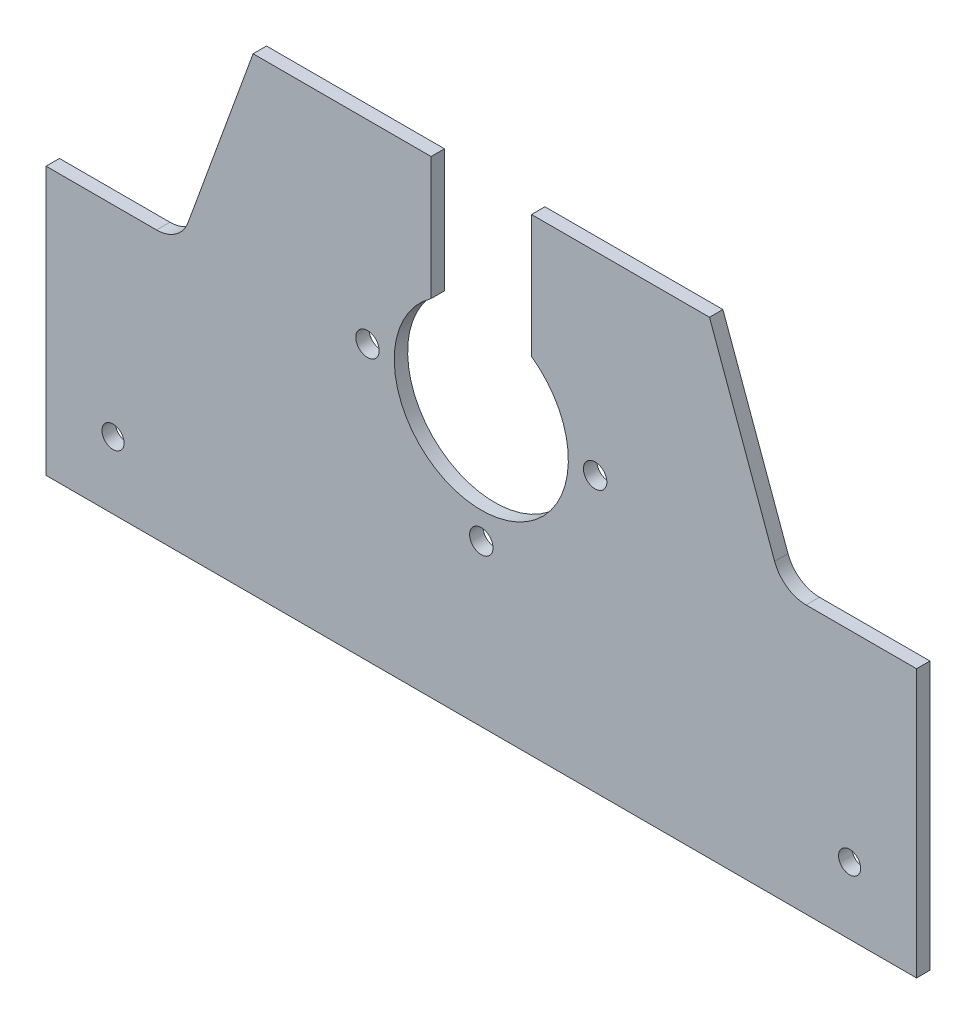
ISO-10303-21;
HEADER;
FILE_DESCRIPTION(('STEP AP214'),'2;1');
FILE_NAME('part.step','',(''),(''),'','','');
FILE_SCHEMA(('AUTOMOTIVE_DESIGN { 1 0 10303 214 1 1 1 1 }'));
ENDSEC;
DATA;
#1=APPLICATION_CONTEXT('core data for automotive mechanical design processes');
#2=APPLICATION_PROTOCOL_DEFINITION('international standard','automotive_design',2000,#1);
#3=PRODUCT_CONTEXT('',#1,'mechanical');
#4=PRODUCT('Part','Part','',(#3));
#5=PRODUCT_RELATED_PRODUCT_CATEGORY('part','',(#4));
#6=PRODUCT_DEFINITION_FORMATION('','',#4);
#7=PRODUCT_DEFINITION_CONTEXT('part definition',#1,'design');
#8=PRODUCT_DEFINITION('design','',#6,#7);
#9=PRODUCT_DEFINITION_SHAPE('','',#8);
#10=(LENGTH_UNIT() NAMED_UNIT(*) SI_UNIT(.MILLI.,.METRE.));
#11=(NAMED_UNIT(*) PLANE_ANGLE_UNIT() SI_UNIT($,.RADIAN.));
#12=(NAMED_UNIT(*) SI_UNIT($,.STERADIAN.) SOLID_ANGLE_UNIT());
#13=UNCERTAINTY_MEASURE_WITH_UNIT(LENGTH_MEASURE(1.E-05),#10,'distance_accuracy_value','');
#14=(GEOMETRIC_REPRESENTATION_CONTEXT(3) GLOBAL_UNCERTAINTY_ASSIGNED_CONTEXT((#13)) GLOBAL_UNIT_ASSIGNED_CONTEXT((#10,
#11,#12)) REPRESENTATION_CONTEXT('',''));
#15=CARTESIAN_POINT('',(0.,0.,0.));
#16=DIRECTION('',(0.,0.,1.));
#17=DIRECTION('',(1.,0.,0.));
#18=AXIS2_PLACEMENT_3D('',#15,#16,#17);
#19=CARTESIAN_POINT('',(-34.0808929720138,50.,2.));
#20=DIRECTION('',(0.,-1.,0.));
#21=DIRECTION('',(1.,0.,0.));
#22=AXIS2_PLACEMENT_3D('',#19,#20,#21);
#23=PLANE('',#22);
#24=DIRECTION('',(-1.,0.,0.));
#25=VECTOR('',#24,1.);
#26=CARTESIAN_POINT('',(-34.0808929720138,50.,0.));
#27=LINE('',#26,#25);
#28=CARTESIAN_POINT('',(34.0808929720138,50.,0.));
#29=VERTEX_POINT('',#28);
#30=CARTESIAN_POINT('',(7.5,50.,0.));
#31=VERTEX_POINT('',#30);
#32=EDGE_CURVE('E172',#29,#31,#27,.T.);
#33=ORIENTED_EDGE('',*,*,#32,.T.);
#34=DIRECTION('',(0.,0.,1.));
#35=VECTOR('',#34,1.);
#36=CARTESIAN_POINT('',(7.5,50.,-3.));
#37=LINE('',#36,#35);
#38=CARTESIAN_POINT('',(7.5,50.,2.));
#39=VERTEX_POINT('',#38);
#40=EDGE_CURVE('E155',#31,#39,#37,.T.);
#41=ORIENTED_EDGE('',*,*,#40,.T.);
#42=DIRECTION('',(-1.,0.,0.));
#43=VECTOR('',#42,1.);
#44=CARTESIAN_POINT('',(-34.0808929720138,50.,2.));
#45=LINE('',#44,#43);
#46=CARTESIAN_POINT('',(34.0808929720138,50.,2.));
#47=VERTEX_POINT('',#46);
#48=EDGE_CURVE('E324',#47,#39,#45,.T.);
#49=ORIENTED_EDGE('',*,*,#48,.F.);
#50=DIRECTION('',(0.,0.,-1.));
#51=VECTOR('',#50,1.);
#52=CARTESIAN_POINT('',(34.0808929720138,50.,2.));
#53=LINE('',#52,#51);
#54=EDGE_CURVE('E229',#47,#29,#53,.T.);
#55=ORIENTED_EDGE('',*,*,#54,.T.);
#56=EDGE_LOOP('',(#33,#41,#49,#55));
#57=FACE_BOUND('',#56,.T.);
#58=ADVANCED_FACE('F47',(#57),#23,.F.);
#59=CARTESIAN_POINT('',(48.5010376910486,20.,2.));
#60=DIRECTION('',(0.,-1.,0.));
#61=DIRECTION('',(1.,0.,0.));
#62=AXIS2_PLACEMENT_3D('',#59,#60,#61);
#63=PLANE('',#62);
#64=DIRECTION('',(-1.,0.,0.));
#65=VECTOR('',#64,1.);
#66=CARTESIAN_POINT('',(48.5010376910486,20.,0.));
#67=LINE('',#66,#65);
#68=CARTESIAN_POINT('',(65.,20.,0.));
#69=VERTEX_POINT('',#68);
#70=CARTESIAN_POINT('',(48.5010376910485,20.,0.));
#71=VERTEX_POINT('',#70);
#72=EDGE_CURVE('E248',#69,#71,#67,.T.);
#73=ORIENTED_EDGE('',*,*,#72,.T.);
#74=DIRECTION('',(0.,0.,-1.));
#75=VECTOR('',#74,1.);
#76=CARTESIAN_POINT('',(48.5010376910485,20.,2.));
#77=LINE('',#76,#75);
#78=CARTESIAN_POINT('',(48.5010376910485,20.,2.));
#79=VERTEX_POINT('',#78);
#80=EDGE_CURVE('E237',#79,#71,#77,.T.);
#81=ORIENTED_EDGE('',*,*,#80,.F.);
#82=DIRECTION('',(-1.,0.,0.));
#83=VECTOR('',#82,1.);
#84=CARTESIAN_POINT('',(48.5010376910486,20.,2.));
#85=LINE('',#84,#83);
#86=CARTESIAN_POINT('',(65.,20.,2.));
#87=VERTEX_POINT('',#86);
#88=EDGE_CURVE('E200',#87,#79,#85,.T.);
#89=ORIENTED_EDGE('',*,*,#88,.F.);
#90=DIRECTION('',(0.,0.,-1.));
#91=VECTOR('',#90,1.);
#92=CARTESIAN_POINT('',(65.,20.,2.));
#93=LINE('',#92,#91);
#94=EDGE_CURVE('E201',#87,#69,#93,.T.);
#95=ORIENTED_EDGE('',*,*,#94,.T.);
#96=EDGE_LOOP('',(#73,#81,#89,#95));
#97=FACE_BOUND('',#96,.T.);
#98=ADVANCED_FACE('F49',(#97),#63,.F.);
#99=CARTESIAN_POINT('',(48.5010376910485,25.,2.));
#100=DIRECTION('',(0.,0.,-1.));
#101=DIRECTION('',(-1.,0.,0.));
#102=AXIS2_PLACEMENT_3D('',#99,#100,#101);
#103=CYLINDRICAL_SURFACE('',#102,5.);
#104=CARTESIAN_POINT('',(48.5010376910485,25.,0.));
#105=DIRECTION('',(0.,0.,-1.));
#106=DIRECTION('',(1.,0.,0.));
#107=AXIS2_PLACEMENT_3D('',#104,#105,#106);
#108=CIRCLE('',#107,5.);
#109=CARTESIAN_POINT('',(43.802574587119,23.2898992833716,0.));
#110=VERTEX_POINT('',#109);
#111=EDGE_CURVE('E179',#71,#110,#108,.T.);
#112=ORIENTED_EDGE('',*,*,#111,.T.);
#113=DIRECTION('',(0.,0.,-1.));
#114=VECTOR('',#113,1.);
#115=CARTESIAN_POINT('',(43.802574587119,23.2898992833716,2.));
#116=LINE('',#115,#114);
#117=CARTESIAN_POINT('',(43.802574587119,23.2898992833716,2.));
#118=VERTEX_POINT('',#117);
#119=EDGE_CURVE('E233',#118,#110,#116,.T.);
#120=ORIENTED_EDGE('',*,*,#119,.F.);
#121=CARTESIAN_POINT('',(48.5010376910485,25.,2.));
#122=DIRECTION('',(0.,0.,-1.));
#123=DIRECTION('',(1.,0.,0.));
#124=AXIS2_PLACEMENT_3D('',#121,#122,#123);
#125=CIRCLE('',#124,5.);
#126=EDGE_CURVE('E265',#79,#118,#125,.T.);
#127=ORIENTED_EDGE('',*,*,#126,.F.);
#128=ORIENTED_EDGE('',*,*,#80,.T.);
#129=EDGE_LOOP('',(#112,#120,#127,#128));
#130=FACE_BOUND('',#129,.T.);
#131=ADVANCED_FACE('F362',(#130),#103,.F.);
#132=CARTESIAN_POINT('',(43.802574587119,23.2898992833716,2.));
#133=DIRECTION('',(-0.939692620785907,-0.342020143325672,0.));
#134=DIRECTION('',(0.342020143325672,-0.939692620785907,0.));
#135=AXIS2_PLACEMENT_3D('',#132,#133,#134);
#136=PLANE('',#135);
#137=DIRECTION('',(-0.342020143325672,0.939692620785907,0.));
#138=VECTOR('',#137,1.);
#139=CARTESIAN_POINT('',(43.802574587119,23.2898992833716,0.));
#140=LINE('',#139,#138);
#141=EDGE_CURVE('E173',#110,#29,#140,.T.);
#142=ORIENTED_EDGE('',*,*,#141,.T.);
#143=ORIENTED_EDGE('',*,*,#54,.F.);
#144=DIRECTION('',(-0.342020143325672,0.939692620785907,0.));
#145=VECTOR('',#144,1.);
#146=CARTESIAN_POINT('',(43.802574587119,23.2898992833716,2.));
#147=LINE('',#146,#145);
#148=EDGE_CURVE('E288',#118,#47,#147,.T.);
#149=ORIENTED_EDGE('',*,*,#148,.F.);
#150=ORIENTED_EDGE('',*,*,#119,.T.);
#151=EDGE_LOOP('',(#142,#143,#149,#150));
#152=FACE_BOUND('',#151,.T.);
#153=ADVANCED_FACE('F347',(#152),#136,.F.);
#154=CARTESIAN_POINT('',(-7.5,50.,2.));
#155=VERTEX_POINT('',#154);
#156=CARTESIAN_POINT('',(-34.0808929720138,50.,2.));
#157=VERTEX_POINT('',#156);
#158=EDGE_CURVE('E163',#155,#157,#45,.T.);
#159=ORIENTED_EDGE('',*,*,#158,.F.);
#160=DIRECTION('',(0.,0.,1.));
#161=VECTOR('',#160,1.);
#162=CARTESIAN_POINT('',(-7.5,50.,-3.));
#163=LINE('',#162,#161);
#164=CARTESIAN_POINT('',(-7.5,50.,0.));
#165=VERTEX_POINT('',#164);
#166=EDGE_CURVE('E149',#165,#155,#163,.T.);
#167=ORIENTED_EDGE('',*,*,#166,.F.);
#168=CARTESIAN_POINT('',(-34.0808929720138,50.,0.));
#169=VERTEX_POINT('',#168);
#170=EDGE_CURVE('E161',#165,#169,#27,.T.);
#171=ORIENTED_EDGE('',*,*,#170,.T.);
#172=DIRECTION('',(0.,0.,-1.));
#173=VECTOR('',#172,1.);
#174=CARTESIAN_POINT('',(-34.0808929720138,50.,2.));
#175=LINE('',#174,#173);
#176=EDGE_CURVE('E226',#157,#169,#175,.T.);
#177=ORIENTED_EDGE('',*,*,#176,.F.);
#178=EDGE_LOOP('',(#159,#167,#171,#177));
#179=FACE_BOUND('',#178,.T.);
#180=ADVANCED_FACE('F159',(#179),#23,.F.);
#181=CARTESIAN_POINT('',(-43.802574587119,23.2898992833716,2.));
#182=DIRECTION('',(0.939692620785907,-0.342020143325672,0.));
#183=DIRECTION('',(0.342020143325672,0.939692620785907,0.));
#184=AXIS2_PLACEMENT_3D('',#181,#182,#183);
#185=PLANE('',#184);
#186=DIRECTION('',(-0.342020143325672,-0.939692620785907,0.));
#187=VECTOR('',#186,1.);
#188=CARTESIAN_POINT('',(-43.802574587119,23.2898992833716,0.));
#189=LINE('',#188,#187);
#190=CARTESIAN_POINT('',(-43.802574587119,23.2898992833716,0.));
#191=VERTEX_POINT('',#190);
#192=EDGE_CURVE('E170',#169,#191,#189,.T.);
#193=ORIENTED_EDGE('',*,*,#192,.T.);
#194=DIRECTION('',(0.,0.,-1.));
#195=VECTOR('',#194,1.);
#196=CARTESIAN_POINT('',(-43.802574587119,23.2898992833716,2.));
#197=LINE('',#196,#195);
#198=CARTESIAN_POINT('',(-43.802574587119,23.2898992833716,2.));
#199=VERTEX_POINT('',#198);
#200=EDGE_CURVE('E222',#199,#191,#197,.T.);
#201=ORIENTED_EDGE('',*,*,#200,.F.);
#202=DIRECTION('',(-0.342020143325672,-0.939692620785907,0.));
#203=VECTOR('',#202,1.);
#204=CARTESIAN_POINT('',(-43.802574587119,23.2898992833716,2.));
#205=LINE('',#204,#203);
#206=EDGE_CURVE('E321',#157,#199,#205,.T.);
#207=ORIENTED_EDGE('',*,*,#206,.F.);
#208=ORIENTED_EDGE('',*,*,#176,.T.);
#209=EDGE_LOOP('',(#193,#201,#207,#208));
#210=FACE_BOUND('',#209,.T.);
#211=ADVANCED_FACE('F367',(#210),#185,.F.);
#212=CARTESIAN_POINT('',(-48.5010376910485,25.,2.));
#213=DIRECTION('',(0.,0.,-1.));
#214=DIRECTION('',(-1.,0.,0.));
#215=AXIS2_PLACEMENT_3D('',#212,#213,#214);
#216=CYLINDRICAL_SURFACE('',#215,5.);
#217=CARTESIAN_POINT('',(-48.5010376910485,25.,0.));
#218=DIRECTION('',(0.,0.,-1.));
#219=DIRECTION('',(-1.,0.,0.));
#220=AXIS2_PLACEMENT_3D('',#217,#218,#219);
#221=CIRCLE('',#220,5.);
#222=CARTESIAN_POINT('',(-48.5010376910485,20.,0.));
#223=VERTEX_POINT('',#222);
#224=EDGE_CURVE('E185',#191,#223,#221,.T.);
#225=ORIENTED_EDGE('',*,*,#224,.T.);
#226=DIRECTION('',(0.,0.,-1.));
#227=VECTOR('',#226,1.);
#228=CARTESIAN_POINT('',(-48.5010376910485,20.,2.));
#229=LINE('',#228,#227);
#230=CARTESIAN_POINT('',(-48.5010376910485,20.,2.));
#231=VERTEX_POINT('',#230);
#232=EDGE_CURVE('E218',#231,#223,#229,.T.);
#233=ORIENTED_EDGE('',*,*,#232,.F.);
#234=CARTESIAN_POINT('',(-48.5010376910485,25.,2.));
#235=DIRECTION('',(0.,0.,-1.));
#236=DIRECTION('',(-1.,0.,0.));
#237=AXIS2_PLACEMENT_3D('',#234,#235,#236);
#238=CIRCLE('',#237,5.);
#239=EDGE_CURVE('E307',#199,#231,#238,.T.);
#240=ORIENTED_EDGE('',*,*,#239,.F.);
#241=ORIENTED_EDGE('',*,*,#200,.T.);
#242=EDGE_LOOP('',(#225,#233,#240,#241));
#243=FACE_BOUND('',#242,.T.);
#244=ADVANCED_FACE('F371',(#243),#216,.F.);
#245=CARTESIAN_POINT('',(-65.,20.,2.));
#246=DIRECTION('',(0.,-1.,0.));
#247=DIRECTION('',(0.,0.,-1.));
#248=AXIS2_PLACEMENT_3D('',#245,#246,#247);
#249=PLANE('',#248);
#250=DIRECTION('',(-1.,0.,0.));
#251=VECTOR('',#250,1.);
#252=CARTESIAN_POINT('',(-65.,20.,0.));
#253=LINE('',#252,#251);
#254=CARTESIAN_POINT('',(-65.,20.,0.));
#255=VERTEX_POINT('',#254);
#256=EDGE_CURVE('E188',#223,#255,#253,.T.);
#257=ORIENTED_EDGE('',*,*,#256,.T.);
#258=DIRECTION('',(0.,0.,-1.));
#259=VECTOR('',#258,1.);
#260=CARTESIAN_POINT('',(-65.,20.,2.));
#261=LINE('',#260,#259);
#262=CARTESIAN_POINT('',(-65.,20.,2.));
#263=VERTEX_POINT('',#262);
#264=EDGE_CURVE('E214',#263,#255,#261,.T.);
#265=ORIENTED_EDGE('',*,*,#264,.F.);
#266=DIRECTION('',(-1.,0.,0.));
#267=VECTOR('',#266,1.);
#268=CARTESIAN_POINT('',(-65.,20.,2.));
#269=LINE('',#268,#267);
#270=EDGE_CURVE('E305',#231,#263,#269,.T.);
#271=ORIENTED_EDGE('',*,*,#270,.F.);
#272=ORIENTED_EDGE('',*,*,#232,.T.);
#273=EDGE_LOOP('',(#257,#265,#271,#272));
#274=FACE_BOUND('',#273,.T.);
#275=ADVANCED_FACE('F397',(#274),#249,.F.);
#276=CARTESIAN_POINT('',(-65.,-20.,2.));
#277=DIRECTION('',(1.,0.,0.));
#278=DIRECTION('',(0.,0.,-1.));
#279=AXIS2_PLACEMENT_3D('',#276,#277,#278);
#280=PLANE('',#279);
#281=DIRECTION('',(0.,-1.,0.));
#282=VECTOR('',#281,1.);
#283=CARTESIAN_POINT('',(-65.,-20.,0.));
#284=LINE('',#283,#282);
#285=CARTESIAN_POINT('',(-65.,-20.,0.));
#286=VERTEX_POINT('',#285);
#287=EDGE_CURVE('E191',#255,#286,#284,.T.);
#288=ORIENTED_EDGE('',*,*,#287,.T.);
#289=DIRECTION('',(0.,0.,-1.));
#290=VECTOR('',#289,1.);
#291=CARTESIAN_POINT('',(-65.,-20.,2.));
#292=LINE('',#291,#290);
#293=CARTESIAN_POINT('',(-65.,-20.,2.));
#294=VERTEX_POINT('',#293);
#295=EDGE_CURVE('E210',#294,#286,#292,.T.);
#296=ORIENTED_EDGE('',*,*,#295,.F.);
#297=DIRECTION('',(0.,-1.,0.));
#298=VECTOR('',#297,1.);
#299=CARTESIAN_POINT('',(-65.,-20.,2.));
#300=LINE('',#299,#298);
#301=EDGE_CURVE('E306',#263,#294,#300,.T.);
#302=ORIENTED_EDGE('',*,*,#301,.F.);
#303=ORIENTED_EDGE('',*,*,#264,.T.);
#304=EDGE_LOOP('',(#288,#296,#302,#303));
#305=FACE_BOUND('',#304,.T.);
#306=ADVANCED_FACE('F393',(#305),#280,.F.);
#307=CARTESIAN_POINT('',(-65.,-20.,2.));
#308=DIRECTION('',(0.,1.,0.));
#309=DIRECTION('',(0.,0.,1.));
#310=AXIS2_PLACEMENT_3D('',#307,#308,#309);
#311=PLANE('',#310);
#312=DIRECTION('',(1.,0.,0.));
#313=VECTOR('',#312,1.);
#314=CARTESIAN_POINT('',(-65.,-20.,0.));
#315=LINE('',#314,#313);
#316=CARTESIAN_POINT('',(65.,-20.,0.));
#317=VERTEX_POINT('',#316);
#318=EDGE_CURVE('E194',#286,#317,#315,.T.);
#319=ORIENTED_EDGE('',*,*,#318,.T.);
#320=DIRECTION('',(0.,0.,-1.));
#321=VECTOR('',#320,1.);
#322=CARTESIAN_POINT('',(65.,-20.,2.));
#323=LINE('',#322,#321);
#324=CARTESIAN_POINT('',(65.,-20.,2.));
#325=VERTEX_POINT('',#324);
#326=EDGE_CURVE('E205',#325,#317,#323,.T.);
#327=ORIENTED_EDGE('',*,*,#326,.F.);
#328=DIRECTION('',(1.,0.,0.));
#329=VECTOR('',#328,1.);
#330=CARTESIAN_POINT('',(-65.,-20.,2.));
#331=LINE('',#330,#329);
#332=EDGE_CURVE('E310',#294,#325,#331,.T.);
#333=ORIENTED_EDGE('',*,*,#332,.F.);
#334=ORIENTED_EDGE('',*,*,#295,.T.);
#335=EDGE_LOOP('',(#319,#327,#333,#334));
#336=FACE_BOUND('',#335,.T.);
#337=ADVANCED_FACE('F389',(#336),#311,.F.);
#338=CARTESIAN_POINT('',(65.,-20.,2.));
#339=DIRECTION('',(-1.,0.,0.));
#340=DIRECTION('',(0.,0.,1.));
#341=AXIS2_PLACEMENT_3D('',#338,#339,#340);
#342=PLANE('',#341);
#343=DIRECTION('',(0.,1.,0.));
#344=VECTOR('',#343,1.);
#345=CARTESIAN_POINT('',(65.,-20.,0.));
#346=LINE('',#345,#344);
#347=EDGE_CURVE('E197',#317,#69,#346,.T.);
#348=ORIENTED_EDGE('',*,*,#347,.T.);
#349=ORIENTED_EDGE('',*,*,#94,.F.);
#350=DIRECTION('',(0.,1.,0.));
#351=VECTOR('',#350,1.);
#352=CARTESIAN_POINT('',(65.,-20.,2.));
#353=LINE('',#352,#351);
#354=EDGE_CURVE('E206',#325,#87,#353,.T.);
#355=ORIENTED_EDGE('',*,*,#354,.F.);
#356=ORIENTED_EDGE('',*,*,#326,.T.);
#357=EDGE_LOOP('',(#348,#349,#355,#356));
#358=FACE_BOUND('',#357,.T.);
#359=ADVANCED_FACE('F385',(#358),#342,.F.);
#360=CARTESIAN_POINT('',(-48.5010376910485,25.,2.));
#361=DIRECTION('',(0.,0.,-1.));
#362=DIRECTION('',(-1.,0.,0.));
#363=AXIS2_PLACEMENT_3D('',#360,#361,#362);
#364=PLANE('',#363);
#365=CARTESIAN_POINT('',(-16.999999999997,20.9999999999972,2.));
#366=DIRECTION('',(0.,0.,1.));
#367=DIRECTION('',(1.,0.,0.));
#368=AXIS2_PLACEMENT_3D('',#365,#366,#367);
#369=CIRCLE('',#368,1.75);
#370=CARTESIAN_POINT('',(-15.249999999997,20.9999999999972,2.));
#371=VERTEX_POINT('',#370);
#372=EDGE_CURVE('E271',#371,#371,#369,.T.);
#373=ORIENTED_EDGE('',*,*,#372,.F.);
#374=EDGE_LOOP('',(#373));
#375=FACE_BOUND('',#374,.T.);
#376=CARTESIAN_POINT('',(5.9497122503797E-12,4.,2.));
#377=DIRECTION('',(0.,0.,1.));
#378=DIRECTION('',(1.,0.,0.));
#379=AXIS2_PLACEMENT_3D('',#376,#377,#378);
#380=CIRCLE('',#379,1.75);
#381=CARTESIAN_POINT('',(1.75000000000595,4.,2.));
#382=VERTEX_POINT('',#381);
#383=EDGE_CURVE('E242',#382,#382,#380,.T.);
#384=ORIENTED_EDGE('',*,*,#383,.F.);
#385=EDGE_LOOP('',(#384));
#386=FACE_BOUND('',#385,.T.);
#387=CARTESIAN_POINT('',(17.000000000003,21.000000000003,2.));
#388=DIRECTION('',(0.,0.,1.));
#389=DIRECTION('',(1.,0.,0.));
#390=AXIS2_PLACEMENT_3D('',#387,#388,#389);
#391=CIRCLE('',#390,1.75);
#392=CARTESIAN_POINT('',(18.750000000003,21.000000000003,2.));
#393=VERTEX_POINT('',#392);
#394=EDGE_CURVE('E252',#393,#393,#391,.T.);
#395=ORIENTED_EDGE('',*,*,#394,.F.);
#396=EDGE_LOOP('',(#395));
#397=FACE_BOUND('',#396,.T.);
#398=ORIENTED_EDGE('',*,*,#48,.T.);
#399=DIRECTION('',(0.,-1.,0.));
#400=VECTOR('',#399,1.);
#401=CARTESIAN_POINT('',(7.5,25.,2.));
#402=LINE('',#401,#400);
#403=CARTESIAN_POINT('',(7.5,31.6183802907977,2.));
#404=VERTEX_POINT('',#403);
#405=EDGE_CURVE('E273',#39,#404,#402,.T.);
#406=ORIENTED_EDGE('',*,*,#405,.T.);
#407=CARTESIAN_POINT('',(0.,21.,2.));
#408=DIRECTION('',(0.,0.,1.));
#409=DIRECTION('',(1.,0.,0.));
#410=AXIS2_PLACEMENT_3D('',#407,#408,#409);
#411=CIRCLE('',#410,13.);
#412=CARTESIAN_POINT('',(-7.5,31.6183802907977,2.));
#413=VERTEX_POINT('',#412);
#414=EDGE_CURVE('E257',#413,#404,#411,.T.);
#415=ORIENTED_EDGE('',*,*,#414,.F.);
#416=DIRECTION('',(0.,1.,0.));
#417=VECTOR('',#416,1.);
#418=CARTESIAN_POINT('',(-7.5,25.,2.));
#419=LINE('',#418,#417);
#420=EDGE_CURVE('E70',#413,#155,#419,.T.);
#421=ORIENTED_EDGE('',*,*,#420,.T.);
#422=ORIENTED_EDGE('',*,*,#158,.T.);
#423=ORIENTED_EDGE('',*,*,#206,.T.);
#424=ORIENTED_EDGE('',*,*,#239,.T.);
#425=ORIENTED_EDGE('',*,*,#270,.T.);
#426=ORIENTED_EDGE('',*,*,#301,.T.);
#427=ORIENTED_EDGE('',*,*,#332,.T.);
#428=ORIENTED_EDGE('',*,*,#354,.T.);
#429=ORIENTED_EDGE('',*,*,#88,.T.);
#430=ORIENTED_EDGE('',*,*,#126,.T.);
#431=ORIENTED_EDGE('',*,*,#148,.T.);
#432=EDGE_LOOP('',(#398,#406,#415,#421,#422,#423,#424,#425,#426,#427,#428,#429,#430,#431));
#433=FACE_BOUND('',#432,.T.);
#434=CARTESIAN_POINT('',(-55.,-10.,2.));
#435=DIRECTION('',(0.,0.,1.));
#436=DIRECTION('',(1.,0.,0.));
#437=AXIS2_PLACEMENT_3D('',#434,#435,#436);
#438=CIRCLE('',#437,1.65);
#439=CARTESIAN_POINT('',(-53.35,-10.,2.));
#440=VERTEX_POINT('',#439);
#441=EDGE_CURVE('E278',#440,#440,#438,.T.);
#442=ORIENTED_EDGE('',*,*,#441,.F.);
#443=EDGE_LOOP('',(#442));
#444=FACE_BOUND('',#443,.T.);
#445=CARTESIAN_POINT('',(55.,-9.99999999999998,2.));
#446=DIRECTION('',(0.,0.,1.));
#447=DIRECTION('',(-1.,0.,0.));
#448=AXIS2_PLACEMENT_3D('',#445,#446,#447);
#449=CIRCLE('',#448,1.65);
#450=CARTESIAN_POINT('',(53.35,-9.99999999999998,2.));
#451=VERTEX_POINT('',#450);
#452=EDGE_CURVE('E256',#451,#451,#449,.T.);
#453=ORIENTED_EDGE('',*,*,#452,.F.);
#454=EDGE_LOOP('',(#453));
#455=FACE_BOUND('',#454,.T.);
#456=ADVANCED_FACE('F340',(#375,#386,#397,#433,#444,#455),#364,.F.);
#457=CARTESIAN_POINT('',(-48.5010376910485,25.,0.));
#458=DIRECTION('',(0.,0.,-1.));
#459=DIRECTION('',(-1.,0.,0.));
#460=AXIS2_PLACEMENT_3D('',#457,#458,#459);
#461=PLANE('',#460);
#462=DIRECTION('',(0.,-1.,0.));
#463=VECTOR('',#462,1.);
#464=CARTESIAN_POINT('',(7.5,25.,0.));
#465=LINE('',#464,#463);
#466=CARTESIAN_POINT('',(7.5,31.6183802907977,0.));
#467=VERTEX_POINT('',#466);
#468=EDGE_CURVE('E62',#31,#467,#465,.T.);
#469=ORIENTED_EDGE('',*,*,#468,.F.);
#470=ORIENTED_EDGE('',*,*,#32,.F.);
#471=ORIENTED_EDGE('',*,*,#141,.F.);
#472=ORIENTED_EDGE('',*,*,#111,.F.);
#473=ORIENTED_EDGE('',*,*,#72,.F.);
#474=ORIENTED_EDGE('',*,*,#347,.F.);
#475=ORIENTED_EDGE('',*,*,#318,.F.);
#476=ORIENTED_EDGE('',*,*,#287,.F.);
#477=ORIENTED_EDGE('',*,*,#256,.F.);
#478=ORIENTED_EDGE('',*,*,#224,.F.);
#479=ORIENTED_EDGE('',*,*,#192,.F.);
#480=ORIENTED_EDGE('',*,*,#170,.F.);
#481=DIRECTION('',(0.,1.,0.));
#482=VECTOR('',#481,1.);
#483=CARTESIAN_POINT('',(-7.5,25.,0.));
#484=LINE('',#483,#482);
#485=CARTESIAN_POINT('',(-7.5,31.6183802907977,0.));
#486=VERTEX_POINT('',#485);
#487=EDGE_CURVE('E146',#486,#165,#484,.T.);
#488=ORIENTED_EDGE('',*,*,#487,.F.);
#489=CARTESIAN_POINT('',(0.,21.,0.));
#490=DIRECTION('',(0.,0.,1.));
#491=DIRECTION('',(1.,0.,0.));
#492=AXIS2_PLACEMENT_3D('',#489,#490,#491);
#493=CIRCLE('',#492,13.);
#494=EDGE_CURVE('E254',#486,#467,#493,.T.);
#495=ORIENTED_EDGE('',*,*,#494,.T.);
#496=EDGE_LOOP('',(#469,#470,#471,#472,#473,#474,#475,#476,#477,#478,#479,#480,#488,#495));
#497=FACE_BOUND('',#496,.T.);
#498=CARTESIAN_POINT('',(-16.999999999997,20.9999999999972,0.));
#499=DIRECTION('',(0.,0.,1.));
#500=DIRECTION('',(1.,0.,0.));
#501=AXIS2_PLACEMENT_3D('',#498,#499,#500);
#502=CIRCLE('',#501,1.75);
#503=CARTESIAN_POINT('',(-15.249999999997,20.9999999999972,0.));
#504=VERTEX_POINT('',#503);
#505=EDGE_CURVE('E245',#504,#504,#502,.T.);
#506=ORIENTED_EDGE('',*,*,#505,.T.);
#507=EDGE_LOOP('',(#506));
#508=FACE_BOUND('',#507,.T.);
#509=CARTESIAN_POINT('',(5.9497122503797E-12,4.,0.));
#510=DIRECTION('',(0.,0.,1.));
#511=DIRECTION('',(1.,0.,0.));
#512=AXIS2_PLACEMENT_3D('',#509,#510,#511);
#513=CIRCLE('',#512,1.75);
#514=CARTESIAN_POINT('',(1.75000000000595,4.,0.));
#515=VERTEX_POINT('',#514);
#516=EDGE_CURVE('E244',#515,#515,#513,.T.);
#517=ORIENTED_EDGE('',*,*,#516,.T.);
#518=EDGE_LOOP('',(#517));
#519=FACE_BOUND('',#518,.T.);
#520=CARTESIAN_POINT('',(17.000000000003,21.000000000003,0.));
#521=DIRECTION('',(0.,0.,1.));
#522=DIRECTION('',(1.,0.,0.));
#523=AXIS2_PLACEMENT_3D('',#520,#521,#522);
#524=CIRCLE('',#523,1.75);
#525=CARTESIAN_POINT('',(18.750000000003,21.000000000003,0.));
#526=VERTEX_POINT('',#525);
#527=EDGE_CURVE('E284',#526,#526,#524,.T.);
#528=ORIENTED_EDGE('',*,*,#527,.T.);
#529=EDGE_LOOP('',(#528));
#530=FACE_BOUND('',#529,.T.);
#531=CARTESIAN_POINT('',(-55.,-10.,0.));
#532=DIRECTION('',(0.,0.,1.));
#533=DIRECTION('',(1.,0.,0.));
#534=AXIS2_PLACEMENT_3D('',#531,#532,#533);
#535=CIRCLE('',#534,1.65);
#536=CARTESIAN_POINT('',(-53.35,-10.,0.));
#537=VERTEX_POINT('',#536);
#538=EDGE_CURVE('E269',#537,#537,#535,.T.);
#539=ORIENTED_EDGE('',*,*,#538,.T.);
#540=EDGE_LOOP('',(#539));
#541=FACE_BOUND('',#540,.T.);
#542=CARTESIAN_POINT('',(55.,-9.99999999999998,0.));
#543=DIRECTION('',(0.,0.,1.));
#544=DIRECTION('',(-1.,0.,0.));
#545=AXIS2_PLACEMENT_3D('',#542,#543,#544);
#546=CIRCLE('',#545,1.65);
#547=CARTESIAN_POINT('',(53.35,-9.99999999999998,0.));
#548=VERTEX_POINT('',#547);
#549=EDGE_CURVE('E261',#548,#548,#546,.T.);
#550=ORIENTED_EDGE('',*,*,#549,.T.);
#551=EDGE_LOOP('',(#550));
#552=FACE_BOUND('',#551,.T.);
#553=ADVANCED_FACE('F167',(#497,#508,#519,#530,#541,#552),#461,.T.);
#554=CARTESIAN_POINT('',(55.,-9.99999999999998,2.));
#555=DIRECTION('',(0.,0.,-1.));
#556=DIRECTION('',(-1.,0.,0.));
#557=AXIS2_PLACEMENT_3D('',#554,#555,#556);
#558=CYLINDRICAL_SURFACE('',#557,1.65);
#559=ORIENTED_EDGE('',*,*,#452,.T.);
#560=EDGE_LOOP('',(#559));
#561=FACE_BOUND('',#560,.T.);
#562=ORIENTED_EDGE('',*,*,#549,.F.);
#563=EDGE_LOOP('',(#562));
#564=FACE_BOUND('',#563,.T.);
#565=ADVANCED_FACE('F417',(#561,#564),#558,.F.);
#566=CARTESIAN_POINT('',(-55.,-10.,2.));
#567=DIRECTION('',(0.,0.,-1.));
#568=DIRECTION('',(-1.,0.,0.));
#569=AXIS2_PLACEMENT_3D('',#566,#567,#568);
#570=CYLINDRICAL_SURFACE('',#569,1.65);
#571=ORIENTED_EDGE('',*,*,#441,.T.);
#572=EDGE_LOOP('',(#571));
#573=FACE_BOUND('',#572,.T.);
#574=ORIENTED_EDGE('',*,*,#538,.F.);
#575=EDGE_LOOP('',(#574));
#576=FACE_BOUND('',#575,.T.);
#577=ADVANCED_FACE('F423',(#573,#576),#570,.F.);
#578=CARTESIAN_POINT('',(0.,21.,2.));
#579=DIRECTION('',(0.,0.,-1.));
#580=DIRECTION('',(-1.,0.,0.));
#581=AXIS2_PLACEMENT_3D('',#578,#579,#580);
#582=CYLINDRICAL_SURFACE('',#581,13.);
#583=DIRECTION('',(0.,0.,-1.));
#584=VECTOR('',#583,1.);
#585=CARTESIAN_POINT('',(7.5,31.6183802907977,2.));
#586=LINE('',#585,#584);
#587=EDGE_CURVE('E11',#467,#404,#586,.F.);
#588=ORIENTED_EDGE('',*,*,#587,.F.);
#589=ORIENTED_EDGE('',*,*,#494,.F.);
#590=DIRECTION('',(0.,0.,-1.));
#591=VECTOR('',#590,1.);
#592=CARTESIAN_POINT('',(-7.5,31.6183802907977,2.));
#593=LINE('',#592,#591);
#594=EDGE_CURVE('E56',#413,#486,#593,.T.);
#595=ORIENTED_EDGE('',*,*,#594,.F.);
#596=ORIENTED_EDGE('',*,*,#414,.T.);
#597=EDGE_LOOP('',(#588,#589,#595,#596));
#598=FACE_BOUND('',#597,.T.);
#599=ADVANCED_FACE('F350',(#598),#582,.F.);
#600=CARTESIAN_POINT('',(17.000000000003,21.000000000003,2.));
#601=DIRECTION('',(0.,0.,-1.));
#602=DIRECTION('',(-1.,0.,0.));
#603=AXIS2_PLACEMENT_3D('',#600,#601,#602);
#604=CYLINDRICAL_SURFACE('',#603,1.75);
#605=ORIENTED_EDGE('',*,*,#394,.T.);
#606=EDGE_LOOP('',(#605));
#607=FACE_BOUND('',#606,.T.);
#608=ORIENTED_EDGE('',*,*,#527,.F.);
#609=EDGE_LOOP('',(#608));
#610=FACE_BOUND('',#609,.T.);
#611=ADVANCED_FACE('F428',(#607,#610),#604,.F.);
#612=CARTESIAN_POINT('',(5.9497122503797E-12,4.,2.));
#613=DIRECTION('',(0.,0.,-1.));
#614=DIRECTION('',(-1.,0.,0.));
#615=AXIS2_PLACEMENT_3D('',#612,#613,#614);
#616=CYLINDRICAL_SURFACE('',#615,1.75);
#617=ORIENTED_EDGE('',*,*,#383,.T.);
#618=EDGE_LOOP('',(#617));
#619=FACE_BOUND('',#618,.T.);
#620=ORIENTED_EDGE('',*,*,#516,.F.);
#621=EDGE_LOOP('',(#620));
#622=FACE_BOUND('',#621,.T.);
#623=ADVANCED_FACE('F431',(#619,#622),#616,.F.);
#624=CARTESIAN_POINT('',(-16.999999999997,20.9999999999972,2.));
#625=DIRECTION('',(0.,0.,-1.));
#626=DIRECTION('',(-1.,0.,0.));
#627=AXIS2_PLACEMENT_3D('',#624,#625,#626);
#628=CYLINDRICAL_SURFACE('',#627,1.75);
#629=ORIENTED_EDGE('',*,*,#372,.T.);
#630=EDGE_LOOP('',(#629));
#631=FACE_BOUND('',#630,.T.);
#632=ORIENTED_EDGE('',*,*,#505,.F.);
#633=EDGE_LOOP('',(#632));
#634=FACE_BOUND('',#633,.T.);
#635=ADVANCED_FACE('F356',(#631,#634),#628,.F.);
#636=CARTESIAN_POINT('',(-7.5,50.,-3.));
#637=DIRECTION('',(-1.,0.,0.));
#638=DIRECTION('',(0.,0.,1.));
#639=AXIS2_PLACEMENT_3D('',#636,#637,#638);
#640=PLANE('',#639);
#641=ORIENTED_EDGE('',*,*,#594,.T.);
#642=ORIENTED_EDGE('',*,*,#487,.T.);
#643=ORIENTED_EDGE('',*,*,#166,.T.);
#644=ORIENTED_EDGE('',*,*,#420,.F.);
#645=EDGE_LOOP('',(#641,#642,#643,#644));
#646=FACE_BOUND('',#645,.T.);
#647=ADVANCED_FACE('F148',(#646),#640,.F.);
#648=CARTESIAN_POINT('',(7.5,27.2519739103462,-3.));
#649=DIRECTION('',(1.,0.,0.));
#650=DIRECTION('',(0.,0.,-1.));
#651=AXIS2_PLACEMENT_3D('',#648,#649,#650);
#652=PLANE('',#651);
#653=ORIENTED_EDGE('',*,*,#40,.F.);
#654=ORIENTED_EDGE('',*,*,#468,.T.);
#655=ORIENTED_EDGE('',*,*,#587,.T.);
#656=ORIENTED_EDGE('',*,*,#405,.F.);
#657=EDGE_LOOP('',(#653,#654,#655,#656));
#658=FACE_BOUND('',#657,.T.);
#659=ADVANCED_FACE('F351',(#658),#652,.F.);
#660=CLOSED_SHELL('',(#58,#98,#131,#153,#180,#211,#244,#275,#306,#337,#359,#456,#553,#565,#577,
#599,#611,#623,#635,#647,#659));
#661=MANIFOLD_SOLID_BREP('B2',#660);
#662=ADVANCED_BREP_SHAPE_REPRESENTATION('',(#18,#661),#14);
#663=SHAPE_DEFINITION_REPRESENTATION(#9,#662);
ENDSEC;
END-ISO-10303-21;
